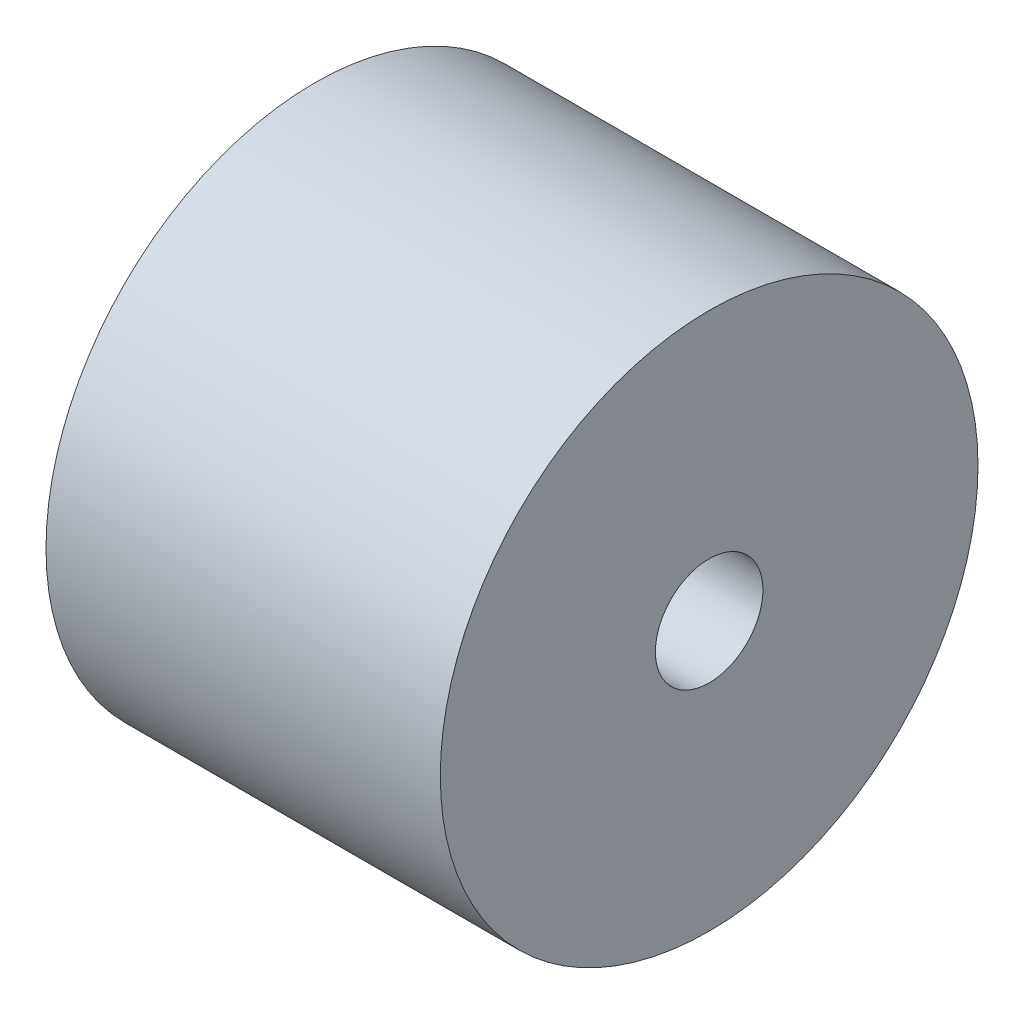
ISO-10303-21;
HEADER;
FILE_DESCRIPTION(('STEP AP214'),'2;1');
FILE_NAME('part.step','',(''),(''),'','','');
FILE_SCHEMA(('AUTOMOTIVE_DESIGN { 1 0 10303 214 1 1 1 1 }'));
ENDSEC;
DATA;
#1=APPLICATION_CONTEXT('core data for automotive mechanical design processes');
#2=APPLICATION_PROTOCOL_DEFINITION('international standard','automotive_design',2000,#1);
#3=PRODUCT_CONTEXT('',#1,'mechanical');
#4=PRODUCT('Part','Part','',(#3));
#5=PRODUCT_RELATED_PRODUCT_CATEGORY('part','',(#4));
#6=PRODUCT_DEFINITION_FORMATION('','',#4);
#7=PRODUCT_DEFINITION_CONTEXT('part definition',#1,'design');
#8=PRODUCT_DEFINITION('design','',#6,#7);
#9=PRODUCT_DEFINITION_SHAPE('','',#8);
#10=(LENGTH_UNIT() NAMED_UNIT(*) SI_UNIT(.MILLI.,.METRE.));
#11=(NAMED_UNIT(*) PLANE_ANGLE_UNIT() SI_UNIT($,.RADIAN.));
#12=(NAMED_UNIT(*) SI_UNIT($,.STERADIAN.) SOLID_ANGLE_UNIT());
#13=UNCERTAINTY_MEASURE_WITH_UNIT(LENGTH_MEASURE(1.E-05),#10,'distance_accuracy_value','');
#14=(GEOMETRIC_REPRESENTATION_CONTEXT(3) GLOBAL_UNCERTAINTY_ASSIGNED_CONTEXT((#13)) GLOBAL_UNIT_ASSIGNED_CONTEXT((#10,
#11,#12)) REPRESENTATION_CONTEXT('',''));
#15=CARTESIAN_POINT('',(0.,0.,0.));
#16=DIRECTION('',(0.,0.,1.));
#17=DIRECTION('',(1.,0.,0.));
#18=AXIS2_PLACEMENT_3D('',#15,#16,#17);
#19=CARTESIAN_POINT('',(0.,0.,0.));
#20=DIRECTION('',(1.,0.,0.));
#21=DIRECTION('',(0.,0.,-1.));
#22=AXIS2_PLACEMENT_3D('',#19,#20,#21);
#23=PLANE('',#22);
#24=CARTESIAN_POINT('',(0.,0.,0.));
#25=DIRECTION('',(1.,0.,0.));
#26=DIRECTION('',(0.,0.,-1.));
#27=AXIS2_PLACEMENT_3D('',#24,#25,#26);
#28=CIRCLE('',#27,3.);
#29=CARTESIAN_POINT('',(0.,0.,3.));
#30=VERTEX_POINT('',#29);
#31=EDGE_CURVE('E42',#30,#30,#28,.T.);
#32=ORIENTED_EDGE('',*,*,#31,.T.);
#33=EDGE_LOOP('',(#32));
#34=FACE_BOUND('',#33,.T.);
#35=CARTESIAN_POINT('',(0.,0.,0.));
#36=DIRECTION('',(-1.,0.,0.));
#37=DIRECTION('',(0.,0.,1.));
#38=AXIS2_PLACEMENT_3D('',#35,#36,#37);
#39=CIRCLE('',#38,15.);
#40=CARTESIAN_POINT('',(0.,0.,15.));
#41=VERTEX_POINT('',#40);
#42=EDGE_CURVE('E10',#41,#41,#39,.T.);
#43=ORIENTED_EDGE('',*,*,#42,.T.);
#44=EDGE_LOOP('',(#43));
#45=FACE_BOUND('',#44,.T.);
#46=ADVANCED_FACE('F32',(#34,#45),#23,.F.);
#47=CARTESIAN_POINT('',(-5.3722174054564,0.,0.));
#48=DIRECTION('',(-1.,0.,0.));
#49=DIRECTION('',(0.,0.,1.));
#50=AXIS2_PLACEMENT_3D('',#47,#48,#49);
#51=CYLINDRICAL_SURFACE('',#50,15.);
#52=ORIENTED_EDGE('',*,*,#42,.F.);
#53=EDGE_LOOP('',(#52));
#54=FACE_BOUND('',#53,.T.);
#55=CARTESIAN_POINT('',(21.9999999999985,0.,0.));
#56=DIRECTION('',(-1.,0.,0.));
#57=DIRECTION('',(0.,0.,1.));
#58=AXIS2_PLACEMENT_3D('',#55,#56,#57);
#59=CIRCLE('',#58,15.);
#60=CARTESIAN_POINT('',(21.9999999999985,0.,15.));
#61=VERTEX_POINT('',#60);
#62=EDGE_CURVE('E38',#61,#61,#59,.T.);
#63=ORIENTED_EDGE('',*,*,#62,.T.);
#64=EDGE_LOOP('',(#63));
#65=FACE_BOUND('',#64,.T.);
#66=ADVANCED_FACE('F62',(#54,#65),#51,.T.);
#67=CARTESIAN_POINT('',(21.9999999999985,0.,-15.));
#68=DIRECTION('',(-1.,0.,0.));
#69=DIRECTION('',(0.,0.,1.));
#70=AXIS2_PLACEMENT_3D('',#67,#68,#69);
#71=PLANE('',#70);
#72=CARTESIAN_POINT('',(21.9999999999985,0.,0.));
#73=DIRECTION('',(-1.,0.,0.));
#74=DIRECTION('',(0.,0.,1.));
#75=AXIS2_PLACEMENT_3D('',#72,#73,#74);
#76=CIRCLE('',#75,3.);
#77=CARTESIAN_POINT('',(21.9999999999985,0.,3.));
#78=VERTEX_POINT('',#77);
#79=EDGE_CURVE('E46',#78,#78,#76,.T.);
#80=ORIENTED_EDGE('',*,*,#79,.T.);
#81=EDGE_LOOP('',(#80));
#82=FACE_BOUND('',#81,.T.);
#83=ORIENTED_EDGE('',*,*,#62,.F.);
#84=EDGE_LOOP('',(#83));
#85=FACE_BOUND('',#84,.T.);
#86=ADVANCED_FACE('F52',(#82,#85),#71,.F.);
#87=CARTESIAN_POINT('',(21.9999999999985,0.,0.));
#88=DIRECTION('',(-1.,0.,0.));
#89=DIRECTION('',(0.,0.,1.));
#90=AXIS2_PLACEMENT_3D('',#87,#88,#89);
#91=CYLINDRICAL_SURFACE('',#90,3.);
#92=CARTESIAN_POINT('',(21.9999999999985,0.,3.));
#93=CARTESIAN_POINT('',(21.7708333333318,0.,3.));
#94=CARTESIAN_POINT('',(21.5416666666652,0.,3.));
#95=CARTESIAN_POINT('',(21.0833333333319,0.,3.));
#96=CARTESIAN_POINT('',(20.8541666666652,0.,3.));
#97=CARTESIAN_POINT('',(20.3958333333319,0.,3.));
#98=CARTESIAN_POINT('',(20.1666666666653,0.,3.));
#99=CARTESIAN_POINT('',(19.708333333332,0.,3.));
#100=CARTESIAN_POINT('',(19.4791666666653,0.,3.));
#101=CARTESIAN_POINT('',(19.020833333332,0.,3.));
#102=CARTESIAN_POINT('',(18.7916666666654,0.,3.));
#103=CARTESIAN_POINT('',(18.3333333333321,0.,3.));
#104=CARTESIAN_POINT('',(18.1041666666654,0.,3.));
#105=CARTESIAN_POINT('',(17.6458333333321,0.,3.));
#106=CARTESIAN_POINT('',(17.4166666666655,0.,3.));
#107=CARTESIAN_POINT('',(16.9583333333321,0.,3.));
#108=CARTESIAN_POINT('',(16.7291666666655,0.,3.));
#109=CARTESIAN_POINT('',(16.2708333333322,0.,3.));
#110=CARTESIAN_POINT('',(16.0416666666655,0.,3.));
#111=CARTESIAN_POINT('',(15.5833333333322,0.,3.));
#112=CARTESIAN_POINT('',(15.3541666666656,0.,3.));
#113=CARTESIAN_POINT('',(14.8958333333323,0.,3.));
#114=CARTESIAN_POINT('',(14.6666666666656,0.,3.));
#115=CARTESIAN_POINT('',(14.2083333333323,0.,3.));
#116=CARTESIAN_POINT('',(13.9791666666657,0.,3.));
#117=CARTESIAN_POINT('',(13.5208333333324,0.,3.));
#118=CARTESIAN_POINT('',(13.2916666666657,0.,3.));
#119=CARTESIAN_POINT('',(12.8333333333324,0.,3.));
#120=CARTESIAN_POINT('',(12.6041666666658,0.,3.));
#121=CARTESIAN_POINT('',(12.1458333333325,0.,3.));
#122=CARTESIAN_POINT('',(11.9166666666658,0.,3.));
#123=CARTESIAN_POINT('',(11.4583333333325,0.,3.));
#124=CARTESIAN_POINT('',(11.2291666666659,0.,3.));
#125=CARTESIAN_POINT('',(10.7708333333326,0.,3.));
#126=CARTESIAN_POINT('',(10.5416666666659,0.,3.));
#127=CARTESIAN_POINT('',(10.0833333333326,0.,3.));
#128=CARTESIAN_POINT('',(9.85416666666598,0.,3.));
#129=CARTESIAN_POINT('',(9.39583333333268,0.,3.));
#130=CARTESIAN_POINT('',(9.16666666666603,0.,3.));
#131=CARTESIAN_POINT('',(8.70833333333273,0.,3.));
#132=CARTESIAN_POINT('',(8.47916666666607,0.,3.));
#133=CARTESIAN_POINT('',(8.02083333333277,0.,3.));
#134=CARTESIAN_POINT('',(7.79166666666612,0.,3.));
#135=CARTESIAN_POINT('',(7.33333333333282,0.,3.));
#136=CARTESIAN_POINT('',(7.10416666666617,0.,3.));
#137=CARTESIAN_POINT('',(6.64583333333287,0.,3.));
#138=CARTESIAN_POINT('',(6.41666666666622,0.,3.));
#139=CARTESIAN_POINT('',(5.95833333333292,0.,3.));
#140=CARTESIAN_POINT('',(5.72916666666626,0.,3.));
#141=CARTESIAN_POINT('',(5.27083333333296,0.,3.));
#142=CARTESIAN_POINT('',(5.04166666666631,0.,3.));
#143=CARTESIAN_POINT('',(4.58333333333301,0.,3.));
#144=CARTESIAN_POINT('',(4.35416666666636,0.,3.));
#145=CARTESIAN_POINT('',(3.89583333333306,0.,3.));
#146=CARTESIAN_POINT('',(3.66666666666641,0.,3.));
#147=CARTESIAN_POINT('',(3.20833333333311,0.,3.));
#148=CARTESIAN_POINT('',(2.97916666666646,0.,3.));
#149=CARTESIAN_POINT('',(2.52083333333315,0.,3.));
#150=CARTESIAN_POINT('',(2.2916666666665,0.,3.));
#151=CARTESIAN_POINT('',(1.8333333333332,0.,3.));
#152=CARTESIAN_POINT('',(1.60416666666655,0.,3.));
#153=CARTESIAN_POINT('',(1.14583333333325,0.,3.));
#154=CARTESIAN_POINT('',(0.916666666666599,0.,3.));
#155=CARTESIAN_POINT('',(0.458333333333298,0.,3.));
#156=CARTESIAN_POINT('',(0.229166666666647,0.,3.));
#157=CARTESIAN_POINT('',(0.,0.,3.));
#158=B_SPLINE_CURVE_WITH_KNOTS('',3,(#92,#93,#94,#95,#96,#97,#98,#99,#100,#101,#102,#103,#104,
#105,#106,#107,#108,#109,#110,#111,#112,#113,#114,#115,#116,#117,#118,#119,#120,#121,#122,#123,
#124,#125,#126,#127,#128,#129,#130,#131,#132,#133,#134,#135,#136,#137,#138,#139,#140,#141,#142,
#143,#144,#145,#146,#147,#148,#149,#150,#151,#152,#153,#154,#155,#156,#157),.UNSPECIFIED.,.F.,
.F.,(4,2,2,2,2,2,2,2,2,2,2,2,2,2,2,2,2,2,2,2,2,2,2,2,2,2,2,2,2,2,2,2,4),(0.,0.687499999999952,
1.3749999999999,2.06249999999986,2.74999999999981,3.43749999999976,4.12499999999971,
4.81249999999966,5.49999999999962,6.18749999999957,6.87499999999952,7.56249999999947,
8.24999999999942,8.93749999999938,9.62499999999933,10.3124999999993,10.9999999999992,
11.6874999999992,12.3749999999991,13.0624999999991,13.749999999999,14.437499999999,
15.1249999999989,15.8124999999989,16.4999999999989,17.1874999999988,17.8749999999988,
18.5624999999987,19.2499999999987,19.9374999999986,20.6249999999986,21.3124999999985,
21.9999999999985),.UNSPECIFIED.);
#159=EDGE_CURVE('BSEAM55',#78,#30,#158,.T.);
#160=ORIENTED_EDGE('',*,*,#79,.F.);
#161=ORIENTED_EDGE('',*,*,#31,.F.);
#162=ORIENTED_EDGE('',*,*,#159,.T.);
#163=ORIENTED_EDGE('',*,*,#159,.F.);
#164=EDGE_LOOP('',(#160,#162,#161,#163));
#165=FACE_BOUND('',#164,.T.);
#166=ADVANCED_FACE('F55',(#165),#91,.F.);
#167=CLOSED_SHELL('',(#46,#66,#86,#166));
#168=MANIFOLD_SOLID_BREP('B2',#167);
#169=ADVANCED_BREP_SHAPE_REPRESENTATION('',(#18,#168),#14);
#170=SHAPE_DEFINITION_REPRESENTATION(#9,#169);
ENDSEC;
END-ISO-10303-21;
